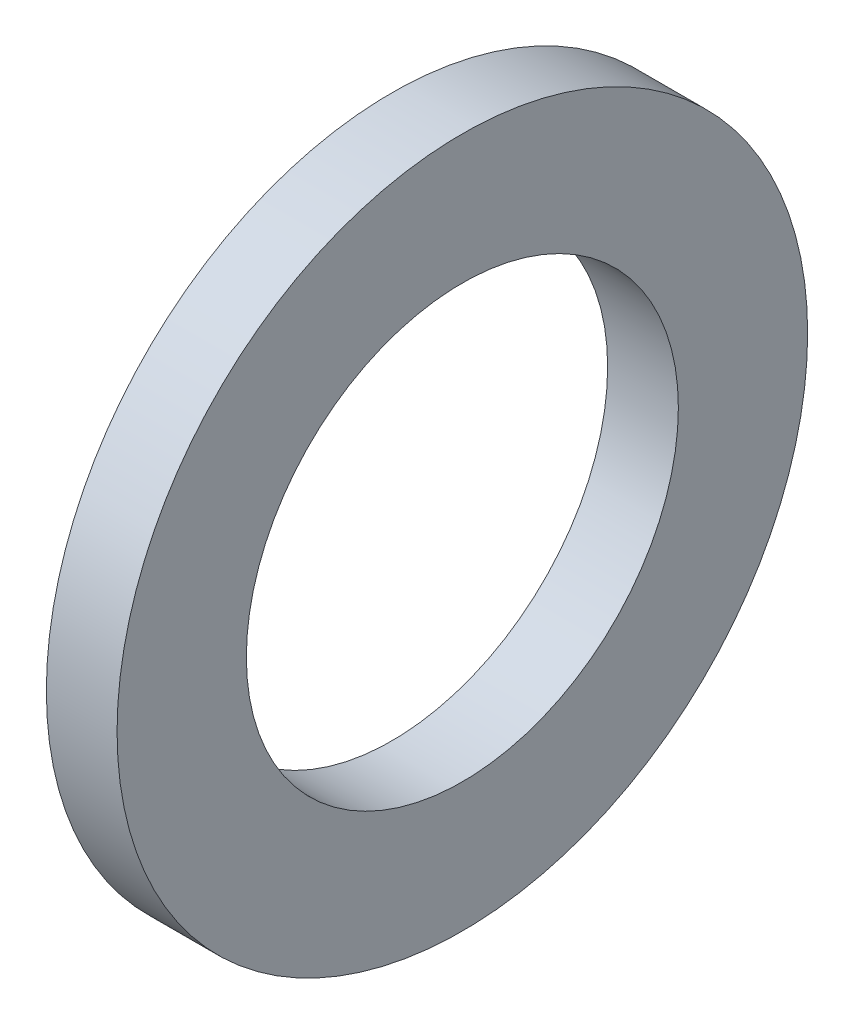
ISO-10303-21;
HEADER;
FILE_DESCRIPTION(('STEP AP214'),'2;1');
FILE_NAME('part.step','',(''),(''),'','','');
FILE_SCHEMA(('AUTOMOTIVE_DESIGN { 1 0 10303 214 1 1 1 1 }'));
ENDSEC;
DATA;
#1=APPLICATION_CONTEXT('core data for automotive mechanical design processes');
#2=APPLICATION_PROTOCOL_DEFINITION('international standard','automotive_design',2000,#1);
#3=PRODUCT_CONTEXT('',#1,'mechanical');
#4=PRODUCT('Part','Part','',(#3));
#5=PRODUCT_RELATED_PRODUCT_CATEGORY('part','',(#4));
#6=PRODUCT_DEFINITION_FORMATION('','',#4);
#7=PRODUCT_DEFINITION_CONTEXT('part definition',#1,'design');
#8=PRODUCT_DEFINITION('design','',#6,#7);
#9=PRODUCT_DEFINITION_SHAPE('','',#8);
#10=(LENGTH_UNIT() NAMED_UNIT(*) SI_UNIT(.MILLI.,.METRE.));
#11=(NAMED_UNIT(*) PLANE_ANGLE_UNIT() SI_UNIT($,.RADIAN.));
#12=(NAMED_UNIT(*) SI_UNIT($,.STERADIAN.) SOLID_ANGLE_UNIT());
#13=UNCERTAINTY_MEASURE_WITH_UNIT(LENGTH_MEASURE(1.E-05),#10,'distance_accuracy_value','');
#14=(GEOMETRIC_REPRESENTATION_CONTEXT(3) GLOBAL_UNCERTAINTY_ASSIGNED_CONTEXT((#13)) GLOBAL_UNIT_ASSIGNED_CONTEXT((#10,
#11,#12)) REPRESENTATION_CONTEXT('',''));
#15=CARTESIAN_POINT('',(0.,0.,0.));
#16=DIRECTION('',(0.,0.,1.));
#17=DIRECTION('',(1.,0.,0.));
#18=AXIS2_PLACEMENT_3D('',#15,#16,#17);
#19=CARTESIAN_POINT('',(0.8128,0.,0.));
#20=DIRECTION('',(1.,0.,0.));
#21=DIRECTION('',(0.,0.,-1.));
#22=AXIS2_PLACEMENT_3D('',#19,#20,#21);
#23=PLANE('',#22);
#24=CARTESIAN_POINT('',(0.8128,0.,0.));
#25=DIRECTION('',(1.,0.,0.));
#26=DIRECTION('',(0.,0.,-1.));
#27=AXIS2_PLACEMENT_3D('',#24,#25,#26);
#28=CIRCLE('',#27,7.9375);
#29=CARTESIAN_POINT('',(0.8128,0.,-7.9375));
#30=VERTEX_POINT('',#29);
#31=EDGE_CURVE('E10',#30,#30,#28,.T.);
#32=ORIENTED_EDGE('',*,*,#31,.T.);
#33=EDGE_LOOP('',(#32));
#34=FACE_BOUND('',#33,.T.);
#35=CARTESIAN_POINT('',(0.8128,0.,0.));
#36=DIRECTION('',(1.,0.,0.));
#37=DIRECTION('',(0.,0.,-1.));
#38=AXIS2_PLACEMENT_3D('',#35,#36,#37);
#39=CIRCLE('',#38,4.9657);
#40=CARTESIAN_POINT('',(0.8128,0.,-4.9657));
#41=VERTEX_POINT('',#40);
#42=EDGE_CURVE('E41',#41,#41,#39,.T.);
#43=ORIENTED_EDGE('',*,*,#42,.F.);
#44=EDGE_LOOP('',(#43));
#45=FACE_BOUND('',#44,.T.);
#46=ADVANCED_FACE('F30',(#34,#45),#23,.T.);
#47=CARTESIAN_POINT('',(-0.8128,0.,0.));
#48=DIRECTION('',(1.,0.,0.));
#49=DIRECTION('',(0.,0.,-1.));
#50=AXIS2_PLACEMENT_3D('',#47,#48,#49);
#51=PLANE('',#50);
#52=CARTESIAN_POINT('',(-0.8128,0.,0.));
#53=DIRECTION('',(1.,0.,0.));
#54=DIRECTION('',(0.,0.,-1.));
#55=AXIS2_PLACEMENT_3D('',#52,#53,#54);
#56=CIRCLE('',#55,7.9375);
#57=CARTESIAN_POINT('',(-0.8128,0.,-7.9375));
#58=VERTEX_POINT('',#57);
#59=EDGE_CURVE('E34',#58,#58,#56,.T.);
#60=ORIENTED_EDGE('',*,*,#59,.F.);
#61=EDGE_LOOP('',(#60));
#62=FACE_BOUND('',#61,.T.);
#63=CARTESIAN_POINT('',(-0.8128,0.,0.));
#64=DIRECTION('',(1.,0.,0.));
#65=DIRECTION('',(0.,0.,-1.));
#66=AXIS2_PLACEMENT_3D('',#63,#64,#65);
#67=CIRCLE('',#66,4.9657);
#68=CARTESIAN_POINT('',(-0.8128,0.,-4.9657));
#69=VERTEX_POINT('',#68);
#70=EDGE_CURVE('E43',#69,#69,#67,.T.);
#71=ORIENTED_EDGE('',*,*,#70,.T.);
#72=EDGE_LOOP('',(#71));
#73=FACE_BOUND('',#72,.T.);
#74=ADVANCED_FACE('F53',(#62,#73),#51,.F.);
#75=CARTESIAN_POINT('',(0.8128,0.,0.));
#76=DIRECTION('',(-1.,0.,0.));
#77=DIRECTION('',(0.,0.,1.));
#78=AXIS2_PLACEMENT_3D('',#75,#76,#77);
#79=CYLINDRICAL_SURFACE('',#78,7.9375);
#80=ORIENTED_EDGE('',*,*,#31,.F.);
#81=EDGE_LOOP('',(#80));
#82=FACE_BOUND('',#81,.T.);
#83=ORIENTED_EDGE('',*,*,#59,.T.);
#84=EDGE_LOOP('',(#83));
#85=FACE_BOUND('',#84,.T.);
#86=ADVANCED_FACE('F32',(#82,#85),#79,.T.);
#87=CARTESIAN_POINT('',(0.8128,0.,0.));
#88=DIRECTION('',(-1.,0.,0.));
#89=DIRECTION('',(0.,0.,1.));
#90=AXIS2_PLACEMENT_3D('',#87,#88,#89);
#91=CYLINDRICAL_SURFACE('',#90,4.9657);
#92=ORIENTED_EDGE('',*,*,#42,.T.);
#93=EDGE_LOOP('',(#92));
#94=FACE_BOUND('',#93,.T.);
#95=ORIENTED_EDGE('',*,*,#70,.F.);
#96=EDGE_LOOP('',(#95));
#97=FACE_BOUND('',#96,.T.);
#98=ADVANCED_FACE('F49',(#94,#97),#91,.F.);
#99=CLOSED_SHELL('',(#46,#74,#86,#98));
#100=MANIFOLD_SOLID_BREP('B2',#99);
#101=ADVANCED_BREP_SHAPE_REPRESENTATION('',(#18,#100),#14);
#102=SHAPE_DEFINITION_REPRESENTATION(#9,#101);
ENDSEC;
END-ISO-10303-21;
